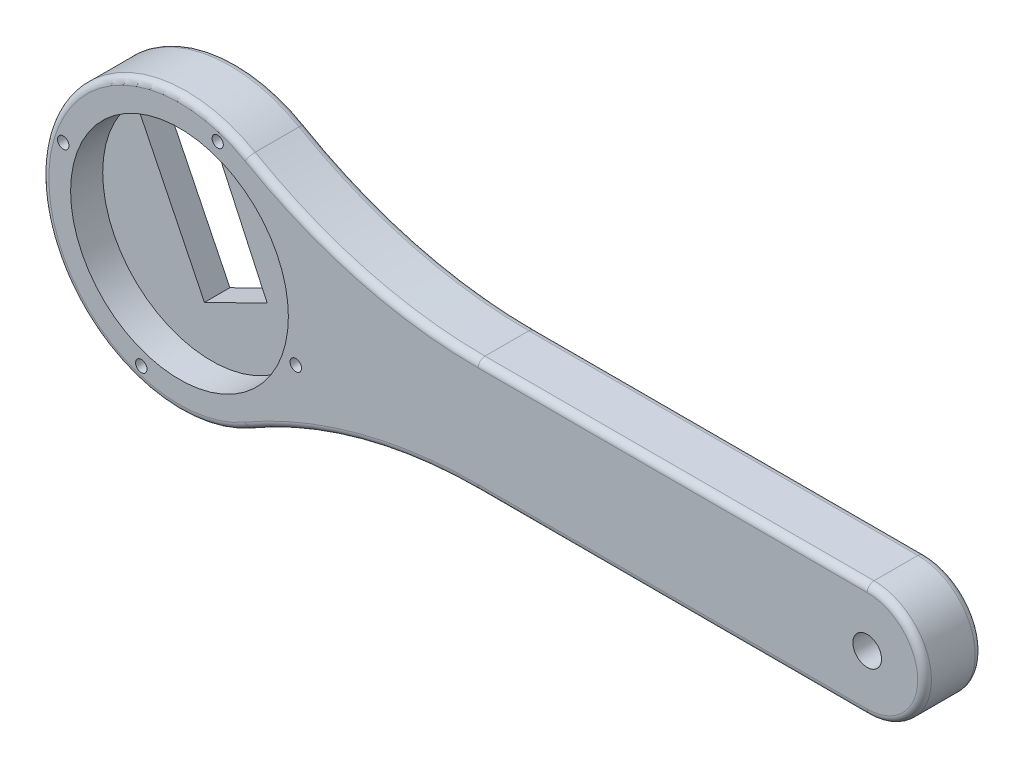
ISO-10303-21;
HEADER;
FILE_DESCRIPTION(('STEP AP214'),'2;1');
FILE_NAME('part.step','',(''),(''),'','','');
FILE_SCHEMA(('AUTOMOTIVE_DESIGN { 1 0 10303 214 1 1 1 1 }'));
ENDSEC;
DATA;
#1=APPLICATION_CONTEXT('core data for automotive mechanical design processes');
#2=APPLICATION_PROTOCOL_DEFINITION('international standard','automotive_design',2000,#1);
#3=PRODUCT_CONTEXT('',#1,'mechanical');
#4=PRODUCT('Part','Part','',(#3));
#5=PRODUCT_RELATED_PRODUCT_CATEGORY('part','',(#4));
#6=PRODUCT_DEFINITION_FORMATION('','',#4);
#7=PRODUCT_DEFINITION_CONTEXT('part definition',#1,'design');
#8=PRODUCT_DEFINITION('design','',#6,#7);
#9=PRODUCT_DEFINITION_SHAPE('','',#8);
#10=(LENGTH_UNIT() NAMED_UNIT(*) SI_UNIT(.MILLI.,.METRE.));
#11=(NAMED_UNIT(*) PLANE_ANGLE_UNIT() SI_UNIT($,.RADIAN.));
#12=(NAMED_UNIT(*) SI_UNIT($,.STERADIAN.) SOLID_ANGLE_UNIT());
#13=UNCERTAINTY_MEASURE_WITH_UNIT(LENGTH_MEASURE(1.E-05),#10,'distance_accuracy_value','');
#14=(GEOMETRIC_REPRESENTATION_CONTEXT(3) GLOBAL_UNCERTAINTY_ASSIGNED_CONTEXT((#13)) GLOBAL_UNIT_ASSIGNED_CONTEXT((#10,
#11,#12)) REPRESENTATION_CONTEXT('',''));
#15=CARTESIAN_POINT('',(0.,0.,0.));
#16=DIRECTION('',(0.,0.,1.));
#17=DIRECTION('',(1.,0.,0.));
#18=AXIS2_PLACEMENT_3D('',#15,#16,#17);
#19=CARTESIAN_POINT('',(0.,0.,25.1));
#20=DIRECTION('',(0.,0.,1.));
#21=DIRECTION('',(1.,0.,0.));
#22=AXIS2_PLACEMENT_3D('',#19,#20,#21);
#23=PLANE('',#22);
#24=DIRECTION('',(1.,0.,0.));
#25=VECTOR('',#24,1.);
#26=CARTESIAN_POINT('',(300.,-22.,25.1));
#27=LINE('',#26,#25);
#28=CARTESIAN_POINT('',(130.288142207954,-22.,25.1));
#29=VERTEX_POINT('',#28);
#30=CARTESIAN_POINT('',(300.,-22.,25.1));
#31=VERTEX_POINT('',#30);
#32=EDGE_CURVE('E52',#29,#31,#27,.T.);
#33=ORIENTED_EDGE('',*,*,#32,.T.);
#34=CARTESIAN_POINT('',(300.,0.,25.1));
#35=DIRECTION('',(0.,0.,1.));
#36=DIRECTION('',(1.,0.,0.));
#37=AXIS2_PLACEMENT_3D('',#34,#35,#36);
#38=CIRCLE('',#37,22.);
#39=CARTESIAN_POINT('',(300.,22.,25.1));
#40=VERTEX_POINT('',#39);
#41=EDGE_CURVE('E317',#31,#40,#38,.T.);
#42=ORIENTED_EDGE('',*,*,#41,.T.);
#43=DIRECTION('',(-1.,0.,0.));
#44=VECTOR('',#43,1.);
#45=CARTESIAN_POINT('',(130.288142207954,22.,25.1));
#46=LINE('',#45,#44);
#47=CARTESIAN_POINT('',(130.288142207954,22.,25.1));
#48=VERTEX_POINT('',#47);
#49=EDGE_CURVE('E309',#40,#48,#46,.T.);
#50=ORIENTED_EDGE('',*,*,#49,.T.);
#51=CARTESIAN_POINT('',(130.288142207954,225.,25.1));
#52=DIRECTION('',(0.,0.,1.));
#53=DIRECTION('',(1.,0.,0.));
#54=AXIS2_PLACEMENT_3D('',#51,#52,#53);
#55=CIRCLE('',#54,203.);
#56=CARTESIAN_POINT('',(28.5631696378976,49.3269230769231,25.1));
#57=VERTEX_POINT('',#56);
#58=EDGE_CURVE('E311',#48,#57,#55,.F.);
#59=ORIENTED_EDGE('',*,*,#58,.T.);
#60=CARTESIAN_POINT('',(0.,0.,25.1));
#61=DIRECTION('',(0.,0.,1.));
#62=DIRECTION('',(1.,0.,0.));
#63=AXIS2_PLACEMENT_3D('',#60,#61,#62);
#64=CIRCLE('',#63,57.);
#65=CARTESIAN_POINT('',(28.5631696378976,-49.3269230769231,25.1));
#66=VERTEX_POINT('',#65);
#67=EDGE_CURVE('E313',#57,#66,#64,.T.);
#68=ORIENTED_EDGE('',*,*,#67,.T.);
#69=CARTESIAN_POINT('',(130.288142207954,-225.,25.1));
#70=DIRECTION('',(0.,0.,1.));
#71=DIRECTION('',(1.,0.,0.));
#72=AXIS2_PLACEMENT_3D('',#69,#70,#71);
#73=CIRCLE('',#72,203.);
#74=EDGE_CURVE('E57',#66,#29,#73,.F.);
#75=ORIENTED_EDGE('',*,*,#74,.T.);
#76=EDGE_LOOP('',(#33,#42,#50,#59,#68,#75));
#77=FACE_BOUND('',#76,.T.);
#78=CARTESIAN_POINT('',(-16.6646971454572,-50.7331044480832,25.1));
#79=DIRECTION('',(0.,0.,1.));
#80=DIRECTION('',(1.,0.,0.));
#81=AXIS2_PLACEMENT_3D('',#78,#79,#80);
#82=CIRCLE('',#81,2.49499865411322);
#83=CARTESIAN_POINT('',(-14.169698491344,-50.7331044480832,25.1));
#84=VERTEX_POINT('',#83);
#85=EDGE_CURVE('E234',#84,#84,#82,.T.);
#86=ORIENTED_EDGE('',*,*,#85,.F.);
#87=EDGE_LOOP('',(#86));
#88=FACE_BOUND('',#87,.T.);
#89=CARTESIAN_POINT('',(-50.7331051137993,16.6646965435116,25.1));
#90=DIRECTION('',(0.,0.,1.));
#91=DIRECTION('',(1.,0.,0.));
#92=AXIS2_PLACEMENT_3D('',#89,#90,#91);
#93=CIRCLE('',#92,2.50000000000001);
#94=CARTESIAN_POINT('',(-48.2331051137992,16.6646965435116,25.1));
#95=VERTEX_POINT('',#94);
#96=EDGE_CURVE('E231',#95,#95,#93,.T.);
#97=ORIENTED_EDGE('',*,*,#96,.F.);
#98=EDGE_LOOP('',(#97));
#99=FACE_BOUND('',#98,.T.);
#100=CARTESIAN_POINT('',(16.6646958777955,50.7331045118536,25.1));
#101=DIRECTION('',(0.,0.,1.));
#102=DIRECTION('',(1.,0.,0.));
#103=AXIS2_PLACEMENT_3D('',#100,#101,#102);
#104=CIRCLE('',#103,2.44444382902341);
#105=CARTESIAN_POINT('',(19.1091397068189,50.7331045118536,25.1));
#106=VERTEX_POINT('',#105);
#107=EDGE_CURVE('E228',#106,#106,#104,.T.);
#108=ORIENTED_EDGE('',*,*,#107,.F.);
#109=EDGE_LOOP('',(#108));
#110=FACE_BOUND('',#109,.T.);
#111=CARTESIAN_POINT('',(50.7331038461375,-16.6646964797411,25.1));
#112=DIRECTION('',(0.,0.,1.));
#113=DIRECTION('',(1.,0.,0.));
#114=AXIS2_PLACEMENT_3D('',#111,#112,#113);
#115=CIRCLE('',#114,2.5);
#116=CARTESIAN_POINT('',(53.2331038461375,-16.6646964797411,25.1));
#117=VERTEX_POINT('',#116);
#118=EDGE_CURVE('E217',#117,#117,#115,.T.);
#119=ORIENTED_EDGE('',*,*,#118,.F.);
#120=EDGE_LOOP('',(#119));
#121=FACE_BOUND('',#120,.T.);
#122=CARTESIAN_POINT('',(0.,0.,25.1));
#123=DIRECTION('',(0.,0.,1.));
#124=DIRECTION('',(1.,0.,0.));
#125=AXIS2_PLACEMENT_3D('',#122,#123,#124);
#126=CIRCLE('',#125,47.5);
#127=CARTESIAN_POINT('',(47.5,0.,25.1));
#128=VERTEX_POINT('',#127);
#129=EDGE_CURVE('E237',#128,#128,#126,.T.);
#130=ORIENTED_EDGE('',*,*,#129,.F.);
#131=EDGE_LOOP('',(#130));
#132=FACE_BOUND('',#131,.T.);
#133=CARTESIAN_POINT('',(300.,0.,25.1));
#134=DIRECTION('',(0.,0.,1.));
#135=DIRECTION('',(1.,0.,0.));
#136=AXIS2_PLACEMENT_3D('',#133,#134,#135);
#137=CIRCLE('',#136,6.25);
#138=CARTESIAN_POINT('',(306.25,0.,25.1));
#139=VERTEX_POINT('',#138);
#140=EDGE_CURVE('E244',#139,#139,#137,.T.);
#141=ORIENTED_EDGE('',*,*,#140,.F.);
#142=EDGE_LOOP('',(#141));
#143=FACE_BOUND('',#142,.T.);
#144=ADVANCED_FACE('F35',(#77,#88,#99,#110,#121,#132,#143),#23,.T.);
#145=CARTESIAN_POINT('',(0.,0.,0.));
#146=DIRECTION('',(0.,0.,1.));
#147=DIRECTION('',(1.,0.,0.));
#148=AXIS2_PLACEMENT_3D('',#145,#146,#147);
#149=PLANE('',#148);
#150=DIRECTION('',(-1.,0.,0.));
#151=VECTOR('',#150,1.);
#152=CARTESIAN_POINT('',(0.,22.,0.));
#153=LINE('',#152,#151);
#154=CARTESIAN_POINT('',(130.288142207954,22.,0.));
#155=VERTEX_POINT('',#154);
#156=CARTESIAN_POINT('',(300.,22.,0.));
#157=VERTEX_POINT('',#156);
#158=EDGE_CURVE('E280',#155,#157,#153,.F.);
#159=ORIENTED_EDGE('',*,*,#158,.T.);
#160=CARTESIAN_POINT('',(300.,0.,0.));
#161=DIRECTION('',(0.,0.,1.));
#162=DIRECTION('',(1.,0.,0.));
#163=AXIS2_PLACEMENT_3D('',#160,#161,#162);
#164=CIRCLE('',#163,22.);
#165=CARTESIAN_POINT('',(300.,-22.,0.));
#166=VERTEX_POINT('',#165);
#167=EDGE_CURVE('E290',#157,#166,#164,.F.);
#168=ORIENTED_EDGE('',*,*,#167,.T.);
#169=DIRECTION('',(1.,0.,0.));
#170=VECTOR('',#169,1.);
#171=CARTESIAN_POINT('',(0.,-22.,0.));
#172=LINE('',#171,#170);
#173=CARTESIAN_POINT('',(130.288142207954,-22.,0.));
#174=VERTEX_POINT('',#173);
#175=EDGE_CURVE('E288',#166,#174,#172,.F.);
#176=ORIENTED_EDGE('',*,*,#175,.T.);
#177=CARTESIAN_POINT('',(130.288142207954,-225.,0.));
#178=DIRECTION('',(0.,0.,1.));
#179=DIRECTION('',(1.,0.,0.));
#180=AXIS2_PLACEMENT_3D('',#177,#178,#179);
#181=CIRCLE('',#180,203.);
#182=CARTESIAN_POINT('',(28.5631696378976,-49.3269230769231,0.));
#183=VERTEX_POINT('',#182);
#184=EDGE_CURVE('E286',#174,#183,#181,.T.);
#185=ORIENTED_EDGE('',*,*,#184,.T.);
#186=CARTESIAN_POINT('',(0.,0.,0.));
#187=DIRECTION('',(0.,0.,1.));
#188=DIRECTION('',(1.,0.,0.));
#189=AXIS2_PLACEMENT_3D('',#186,#187,#188);
#190=CIRCLE('',#189,57.);
#191=CARTESIAN_POINT('',(28.5631696378975,49.326923076923,0.));
#192=VERTEX_POINT('',#191);
#193=EDGE_CURVE('E284',#183,#192,#190,.F.);
#194=ORIENTED_EDGE('',*,*,#193,.T.);
#195=CARTESIAN_POINT('',(130.288142207954,225.,0.));
#196=DIRECTION('',(0.,0.,1.));
#197=DIRECTION('',(1.,0.,0.));
#198=AXIS2_PLACEMENT_3D('',#195,#196,#197);
#199=CIRCLE('',#198,203.);
#200=EDGE_CURVE('E282',#192,#155,#199,.T.);
#201=ORIENTED_EDGE('',*,*,#200,.T.);
#202=EDGE_LOOP('',(#159,#168,#176,#185,#194,#201));
#203=FACE_BOUND('',#202,.T.);
#204=DIRECTION('',(-0.419041540891961,0.907967062732394,0.));
#205=VECTOR('',#204,1.);
#206=CARTESIAN_POINT('',(24.2542425387327,-13.5054924410071,0.));
#207=LINE('',#206,#205);
#208=CARTESIAN_POINT('',(24.2542425387327,-13.5054924410071,0.));
#209=VERTEX_POINT('',#208);
#210=CARTESIAN_POINT('',(-3.65077876777675,46.9582987555049,0.));
#211=VERTEX_POINT('',#210);
#212=EDGE_CURVE('E161',#209,#211,#207,.T.);
#213=ORIENTED_EDGE('',*,*,#212,.T.);
#214=DIRECTION('',(-0.898004276946711,-0.439986725465001,0.));
#215=VECTOR('',#214,1.);
#216=CARTESIAN_POINT('',(-3.65077876777675,46.9582987555049,0.));
#217=LINE('',#216,#215);
#218=CARTESIAN_POINT('',(-32.4009428030412,32.8718507783665,0.));
#219=VERTEX_POINT('',#218);
#220=EDGE_CURVE('E154',#211,#219,#217,.T.);
#221=ORIENTED_EDGE('',*,*,#220,.T.);
#222=DIRECTION('',(0.439986725465001,-0.898004276946711,0.));
#223=VECTOR('',#222,1.);
#224=CARTESIAN_POINT('',(-32.4009428030412,32.8718507783665,0.));
#225=LINE('',#224,#223);
#226=CARTESIAN_POINT('',(-3.10901045049288,-26.9124086326927,0.));
#227=VERTEX_POINT('',#226);
#228=EDGE_CURVE('E165',#219,#227,#225,.T.);
#229=ORIENTED_EDGE('',*,*,#228,.T.);
#230=DIRECTION('',(0.898004276946711,0.439986725465001,0.));
#231=VECTOR('',#230,1.);
#232=CARTESIAN_POINT('',(-3.10901045049288,-26.9124086326927,0.));
#233=LINE('',#232,#231);
#234=EDGE_CURVE('E170',#227,#209,#233,.T.);
#235=ORIENTED_EDGE('',*,*,#234,.T.);
#236=EDGE_LOOP('',(#213,#221,#229,#235));
#237=FACE_BOUND('',#236,.T.);
#238=CARTESIAN_POINT('',(-11.9735029881181,47.2126105483995,0.));
#239=DIRECTION('',(0.,0.,-1.));
#240=DIRECTION('',(-1.,0.,0.));
#241=AXIS2_PLACEMENT_3D('',#238,#239,#240);
#242=CIRCLE('',#241,3.);
#243=CARTESIAN_POINT('',(-14.9735029881181,47.2126105483995,0.));
#244=VERTEX_POINT('',#243);
#245=EDGE_CURVE('E194',#244,#244,#242,.T.);
#246=ORIENTED_EDGE('',*,*,#245,.F.);
#247=EDGE_LOOP('',(#246));
#248=FACE_BOUND('',#247,.T.);
#249=CARTESIAN_POINT('',(-27.3812859892251,40.0292810285461,0.));
#250=DIRECTION('',(0.,0.,-1.));
#251=DIRECTION('',(-1.,0.,0.));
#252=AXIS2_PLACEMENT_3D('',#249,#250,#251);
#253=CIRCLE('',#252,3.);
#254=CARTESIAN_POINT('',(-30.3812859892251,40.0292810285461,0.));
#255=VERTEX_POINT('',#254);
#256=EDGE_CURVE('E200',#255,#255,#253,.T.);
#257=ORIENTED_EDGE('',*,*,#256,.F.);
#258=EDGE_LOOP('',(#257));
#259=FACE_BOUND('',#258,.T.);
#260=CARTESIAN_POINT('',(19.7176566582941,-20.7629026917785,0.));
#261=DIRECTION('',(0.,0.,-1.));
#262=DIRECTION('',(-1.,0.,0.));
#263=AXIS2_PLACEMENT_3D('',#260,#261,#262);
#264=CIRCLE('',#263,3.);
#265=CARTESIAN_POINT('',(16.7176566582941,-20.7629026917785,0.));
#266=VERTEX_POINT('',#265);
#267=EDGE_CURVE('E206',#266,#266,#264,.T.);
#268=ORIENTED_EDGE('',*,*,#267,.F.);
#269=EDGE_LOOP('',(#268));
#270=FACE_BOUND('',#269,.T.);
#271=CARTESIAN_POINT('',(4.30987365718704,-27.9462322116319,0.));
#272=DIRECTION('',(0.,0.,-1.));
#273=DIRECTION('',(-1.,0.,0.));
#274=AXIS2_PLACEMENT_3D('',#271,#272,#273);
#275=CIRCLE('',#274,3.);
#276=CARTESIAN_POINT('',(1.30987365718704,-27.9462322116319,0.));
#277=VERTEX_POINT('',#276);
#278=EDGE_CURVE('E185',#277,#277,#275,.T.);
#279=ORIENTED_EDGE('',*,*,#278,.F.);
#280=EDGE_LOOP('',(#279));
#281=FACE_BOUND('',#280,.T.);
#282=CARTESIAN_POINT('',(-16.6646971454572,-50.7331044480832,0.));
#283=DIRECTION('',(0.,0.,1.));
#284=DIRECTION('',(1.,0.,0.));
#285=AXIS2_PLACEMENT_3D('',#282,#283,#284);
#286=CIRCLE('',#285,2.49499865411322);
#287=CARTESIAN_POINT('',(-14.169698491344,-50.7331044480832,0.));
#288=VERTEX_POINT('',#287);
#289=EDGE_CURVE('E214',#288,#288,#286,.T.);
#290=ORIENTED_EDGE('',*,*,#289,.T.);
#291=EDGE_LOOP('',(#290));
#292=FACE_BOUND('',#291,.T.);
#293=CARTESIAN_POINT('',(-50.7331051137993,16.6646965435116,0.));
#294=DIRECTION('',(0.,0.,1.));
#295=DIRECTION('',(1.,0.,0.));
#296=AXIS2_PLACEMENT_3D('',#293,#294,#295);
#297=CIRCLE('',#296,2.50000000000001);
#298=CARTESIAN_POINT('',(-48.2331051137992,16.6646965435116,0.));
#299=VERTEX_POINT('',#298);
#300=EDGE_CURVE('E218',#299,#299,#297,.T.);
#301=ORIENTED_EDGE('',*,*,#300,.T.);
#302=EDGE_LOOP('',(#301));
#303=FACE_BOUND('',#302,.T.);
#304=CARTESIAN_POINT('',(16.6646958777955,50.7331045118536,0.));
#305=DIRECTION('',(0.,0.,1.));
#306=DIRECTION('',(1.,0.,0.));
#307=AXIS2_PLACEMENT_3D('',#304,#305,#306);
#308=CIRCLE('',#307,2.44444382902341);
#309=CARTESIAN_POINT('',(19.1091397068189,50.7331045118536,0.));
#310=VERTEX_POINT('',#309);
#311=EDGE_CURVE('E221',#310,#310,#308,.T.);
#312=ORIENTED_EDGE('',*,*,#311,.T.);
#313=EDGE_LOOP('',(#312));
#314=FACE_BOUND('',#313,.T.);
#315=CARTESIAN_POINT('',(50.7331038461375,-16.6646964797411,0.));
#316=DIRECTION('',(0.,0.,1.));
#317=DIRECTION('',(1.,0.,0.));
#318=AXIS2_PLACEMENT_3D('',#315,#316,#317);
#319=CIRCLE('',#318,2.5);
#320=CARTESIAN_POINT('',(53.2331038461375,-16.6646964797411,0.));
#321=VERTEX_POINT('',#320);
#322=EDGE_CURVE('E193',#321,#321,#319,.T.);
#323=ORIENTED_EDGE('',*,*,#322,.T.);
#324=EDGE_LOOP('',(#323));
#325=FACE_BOUND('',#324,.T.);
#326=CARTESIAN_POINT('',(300.,0.,0.));
#327=DIRECTION('',(0.,0.,1.));
#328=DIRECTION('',(1.,0.,0.));
#329=AXIS2_PLACEMENT_3D('',#326,#327,#328);
#330=CIRCLE('',#329,6.25);
#331=CARTESIAN_POINT('',(306.25,0.,0.));
#332=VERTEX_POINT('',#331);
#333=EDGE_CURVE('E241',#332,#332,#330,.T.);
#334=ORIENTED_EDGE('',*,*,#333,.T.);
#335=EDGE_LOOP('',(#334));
#336=FACE_BOUND('',#335,.T.);
#337=ADVANCED_FACE('F172',(#203,#237,#248,#259,#270,#281,#292,#303,#314,#325,#336),#149,.F.);
#338=CARTESIAN_POINT('',(0.,0.,25.1));
#339=DIRECTION('',(0.,0.,-1.));
#340=DIRECTION('',(-1.,0.,0.));
#341=AXIS2_PLACEMENT_3D('',#338,#339,#340);
#342=CYLINDRICAL_SURFACE('',#341,60.);
#343=DIRECTION('',(0.,0.,-1.));
#344=VECTOR('',#343,1.);
#345=CARTESIAN_POINT('',(30.0664943556816,51.9230769230769,25.1));
#346=LINE('',#345,#344);
#347=CARTESIAN_POINT('',(30.0664943556816,51.9230769230769,22.1));
#348=VERTEX_POINT('',#347);
#349=CARTESIAN_POINT('',(30.0664943556816,51.9230769230769,3.));
#350=VERTEX_POINT('',#349);
#351=EDGE_CURVE('E265',#348,#350,#346,.T.);
#352=ORIENTED_EDGE('',*,*,#351,.T.);
#353=CARTESIAN_POINT('',(0.,0.,3.));
#354=DIRECTION('',(0.,0.,1.));
#355=DIRECTION('',(1.,0.,0.));
#356=AXIS2_PLACEMENT_3D('',#353,#354,#355);
#357=CIRCLE('',#356,60.);
#358=CARTESIAN_POINT('',(30.0664943556816,-51.9230769230769,3.));
#359=VERTEX_POINT('',#358);
#360=EDGE_CURVE('E303',#350,#359,#357,.T.);
#361=ORIENTED_EDGE('',*,*,#360,.T.);
#362=DIRECTION('',(0.,0.,-1.));
#363=VECTOR('',#362,1.);
#364=CARTESIAN_POINT('',(30.0664943556816,-51.9230769230769,25.1));
#365=LINE('',#364,#363);
#366=CARTESIAN_POINT('',(30.0664943556816,-51.9230769230769,22.1));
#367=VERTEX_POINT('',#366);
#368=EDGE_CURVE('E268',#359,#367,#365,.F.);
#369=ORIENTED_EDGE('',*,*,#368,.T.);
#370=CARTESIAN_POINT('',(0.,0.,22.1));
#371=DIRECTION('',(0.,0.,1.));
#372=DIRECTION('',(1.,0.,0.));
#373=AXIS2_PLACEMENT_3D('',#370,#371,#372);
#374=CIRCLE('',#373,60.);
#375=EDGE_CURVE('E301',#367,#348,#374,.F.);
#376=ORIENTED_EDGE('',*,*,#375,.T.);
#377=EDGE_LOOP('',(#352,#361,#369,#376));
#378=FACE_BOUND('',#377,.T.);
#379=ADVANCED_FACE('F357',(#378),#342,.T.);
#380=CARTESIAN_POINT('',(54.5435605731786,-25.,25.1));
#381=DIRECTION('',(0.,1.,0.));
#382=DIRECTION('',(0.,0.,1.));
#383=AXIS2_PLACEMENT_3D('',#380,#381,#382);
#384=PLANE('',#383);
#385=DIRECTION('',(0.,0.,1.));
#386=VECTOR('',#385,1.);
#387=CARTESIAN_POINT('',(130.288142207954,-25.,0.));
#388=LINE('',#387,#386);
#389=CARTESIAN_POINT('',(130.288142207954,-25.,22.1));
#390=VERTEX_POINT('',#389);
#391=CARTESIAN_POINT('',(130.288142207954,-25.,3.));
#392=VERTEX_POINT('',#391);
#393=EDGE_CURVE('E262',#390,#392,#388,.F.);
#394=ORIENTED_EDGE('',*,*,#393,.T.);
#395=DIRECTION('',(1.,0.,0.));
#396=VECTOR('',#395,1.);
#397=CARTESIAN_POINT('',(54.5435605731786,-25.,3.));
#398=LINE('',#397,#396);
#399=CARTESIAN_POINT('',(300.,-25.,3.));
#400=VERTEX_POINT('',#399);
#401=EDGE_CURVE('E295',#392,#400,#398,.T.);
#402=ORIENTED_EDGE('',*,*,#401,.T.);
#403=DIRECTION('',(0.,0.,-1.));
#404=VECTOR('',#403,1.);
#405=CARTESIAN_POINT('',(300.,-25.,25.1));
#406=LINE('',#405,#404);
#407=CARTESIAN_POINT('',(300.,-25.,22.1));
#408=VERTEX_POINT('',#407);
#409=EDGE_CURVE('E252',#408,#400,#406,.T.);
#410=ORIENTED_EDGE('',*,*,#409,.F.);
#411=DIRECTION('',(1.,0.,0.));
#412=VECTOR('',#411,1.);
#413=CARTESIAN_POINT('',(130.288142207954,-25.,22.1));
#414=LINE('',#413,#412);
#415=EDGE_CURVE('E293',#408,#390,#414,.F.);
#416=ORIENTED_EDGE('',*,*,#415,.T.);
#417=EDGE_LOOP('',(#394,#402,#410,#416));
#418=FACE_BOUND('',#417,.T.);
#419=ADVANCED_FACE('F397',(#418),#384,.F.);
#420=CARTESIAN_POINT('',(300.,0.,25.1));
#421=DIRECTION('',(0.,0.,-1.));
#422=DIRECTION('',(-1.,0.,0.));
#423=AXIS2_PLACEMENT_3D('',#420,#421,#422);
#424=CYLINDRICAL_SURFACE('',#423,25.);
#425=ORIENTED_EDGE('',*,*,#409,.T.);
#426=CARTESIAN_POINT('',(300.,0.,3.));
#427=DIRECTION('',(0.,0.,1.));
#428=DIRECTION('',(1.,0.,0.));
#429=AXIS2_PLACEMENT_3D('',#426,#427,#428);
#430=CIRCLE('',#429,25.);
#431=CARTESIAN_POINT('',(300.,25.,3.));
#432=VERTEX_POINT('',#431);
#433=EDGE_CURVE('E277',#400,#432,#430,.T.);
#434=ORIENTED_EDGE('',*,*,#433,.T.);
#435=DIRECTION('',(0.,0.,-1.));
#436=VECTOR('',#435,1.);
#437=CARTESIAN_POINT('',(300.,25.,25.1));
#438=LINE('',#437,#436);
#439=CARTESIAN_POINT('',(300.,25.,22.1));
#440=VERTEX_POINT('',#439);
#441=EDGE_CURVE('E247',#440,#432,#438,.T.);
#442=ORIENTED_EDGE('',*,*,#441,.F.);
#443=CARTESIAN_POINT('',(300.,0.,22.1));
#444=DIRECTION('',(0.,0.,1.));
#445=DIRECTION('',(1.,0.,0.));
#446=AXIS2_PLACEMENT_3D('',#443,#444,#445);
#447=CIRCLE('',#446,25.);
#448=EDGE_CURVE('E274',#440,#408,#447,.F.);
#449=ORIENTED_EDGE('',*,*,#448,.T.);
#450=EDGE_LOOP('',(#425,#434,#442,#449));
#451=FACE_BOUND('',#450,.T.);
#452=ADVANCED_FACE('F406',(#451),#424,.T.);
#453=CARTESIAN_POINT('',(54.5435605731786,25.,25.1));
#454=DIRECTION('',(0.,-1.,0.));
#455=DIRECTION('',(0.,0.,-1.));
#456=AXIS2_PLACEMENT_3D('',#453,#454,#455);
#457=PLANE('',#456);
#458=ORIENTED_EDGE('',*,*,#441,.T.);
#459=DIRECTION('',(-1.,0.,0.));
#460=VECTOR('',#459,1.);
#461=CARTESIAN_POINT('',(54.5435605731786,25.,3.));
#462=LINE('',#461,#460);
#463=CARTESIAN_POINT('',(130.288142207954,25.,3.));
#464=VERTEX_POINT('',#463);
#465=EDGE_CURVE('E11',#432,#464,#462,.T.);
#466=ORIENTED_EDGE('',*,*,#465,.T.);
#467=DIRECTION('',(0.,0.,1.));
#468=VECTOR('',#467,1.);
#469=CARTESIAN_POINT('',(130.288142207954,25.,25.1));
#470=LINE('',#469,#468);
#471=CARTESIAN_POINT('',(130.288142207954,25.,22.1));
#472=VERTEX_POINT('',#471);
#473=EDGE_CURVE('E271',#464,#472,#470,.T.);
#474=ORIENTED_EDGE('',*,*,#473,.T.);
#475=DIRECTION('',(-1.,0.,0.));
#476=VECTOR('',#475,1.);
#477=CARTESIAN_POINT('',(300.,25.,22.1));
#478=LINE('',#477,#476);
#479=EDGE_CURVE('E44',#472,#440,#478,.F.);
#480=ORIENTED_EDGE('',*,*,#479,.T.);
#481=EDGE_LOOP('',(#458,#466,#474,#480));
#482=FACE_BOUND('',#481,.T.);
#483=ADVANCED_FACE('F434',(#482),#457,.F.);
#484=CARTESIAN_POINT('',(300.,0.,25.1));
#485=DIRECTION('',(0.,0.,-1.));
#486=DIRECTION('',(-1.,0.,0.));
#487=AXIS2_PLACEMENT_3D('',#484,#485,#486);
#488=CYLINDRICAL_SURFACE('',#487,6.25);
#489=ORIENTED_EDGE('',*,*,#140,.T.);
#490=EDGE_LOOP('',(#489));
#491=FACE_BOUND('',#490,.T.);
#492=ORIENTED_EDGE('',*,*,#333,.F.);
#493=EDGE_LOOP('',(#492));
#494=FACE_BOUND('',#493,.T.);
#495=ADVANCED_FACE('F430',(#491,#494),#488,.F.);
#496=CARTESIAN_POINT('',(0.,0.,11.1));
#497=DIRECTION('',(0.,0.,1.));
#498=DIRECTION('',(1.,0.,0.));
#499=AXIS2_PLACEMENT_3D('',#496,#497,#498);
#500=CYLINDRICAL_SURFACE('',#499,47.5);
#501=CARTESIAN_POINT('',(0.,0.,11.1));
#502=DIRECTION('',(0.,0.,1.));
#503=DIRECTION('',(1.,0.,0.));
#504=AXIS2_PLACEMENT_3D('',#501,#502,#503);
#505=CIRCLE('',#504,47.5);
#506=CARTESIAN_POINT('',(47.5,0.,11.1));
#507=VERTEX_POINT('',#506);
#508=EDGE_CURVE('E238',#507,#507,#505,.T.);
#509=ORIENTED_EDGE('',*,*,#508,.F.);
#510=EDGE_LOOP('',(#509));
#511=FACE_BOUND('',#510,.T.);
#512=ORIENTED_EDGE('',*,*,#129,.T.);
#513=EDGE_LOOP('',(#512));
#514=FACE_BOUND('',#513,.T.);
#515=ADVANCED_FACE('F433',(#511,#514),#500,.F.);
#516=CARTESIAN_POINT('',(0.,0.,11.1));
#517=DIRECTION('',(0.,0.,1.));
#518=DIRECTION('',(1.,0.,0.));
#519=AXIS2_PLACEMENT_3D('',#516,#517,#518);
#520=PLANE('',#519);
#521=DIRECTION('',(-0.898004276946711,-0.439986725465001,0.));
#522=VECTOR('',#521,1.);
#523=CARTESIAN_POINT('',(-19.2604397256494,39.3101797133271,11.1));
#524=LINE('',#523,#522);
#525=CARTESIAN_POINT('',(-3.65077876777675,46.9582987555049,11.1));
#526=VERTEX_POINT('',#525);
#527=CARTESIAN_POINT('',(-32.4009428030412,32.8718507783665,11.1));
#528=VERTEX_POINT('',#527);
#529=EDGE_CURVE('E157',#526,#528,#524,.T.);
#530=ORIENTED_EDGE('',*,*,#529,.F.);
#531=DIRECTION('',(-0.419041540891961,0.907967062732394,0.));
#532=VECTOR('',#531,1.);
#533=CARTESIAN_POINT('',(14.8567844799547,6.85664724714234,11.1));
#534=LINE('',#533,#532);
#535=CARTESIAN_POINT('',(24.2542425387327,-13.5054924410071,11.1));
#536=VERTEX_POINT('',#535);
#537=EDGE_CURVE('E259',#536,#526,#534,.T.);
#538=ORIENTED_EDGE('',*,*,#537,.F.);
#539=DIRECTION('',(0.898004276946711,0.439986725465001,0.));
#540=VECTOR('',#539,1.);
#541=CARTESIAN_POINT('',(10.0314926268989,-20.4740796977321,11.1));
#542=LINE('',#541,#540);
#543=CARTESIAN_POINT('',(-3.10901045049288,-26.9124086326927,11.1));
#544=VERTEX_POINT('',#543);
#545=EDGE_CURVE('E257',#544,#536,#542,.T.);
#546=ORIENTED_EDGE('',*,*,#545,.F.);
#547=DIRECTION('',(0.439986725465001,-0.898004276946711,0.));
#548=VECTOR('',#547,1.);
#549=CARTESIAN_POINT('',(-13.1405030773918,-6.43832893496059,11.1));
#550=LINE('',#549,#548);
#551=EDGE_CURVE('E255',#528,#544,#550,.T.);
#552=ORIENTED_EDGE('',*,*,#551,.F.);
#553=EDGE_LOOP('',(#530,#538,#546,#552));
#554=FACE_BOUND('',#553,.T.);
#555=ORIENTED_EDGE('',*,*,#508,.T.);
#556=EDGE_LOOP('',(#555));
#557=FACE_BOUND('',#556,.T.);
#558=ADVANCED_FACE('F640',(#554,#557),#520,.T.);
#559=CARTESIAN_POINT('',(50.7331038461375,-16.6646964797411,0.));
#560=DIRECTION('',(0.,0.,1.));
#561=DIRECTION('',(1.,0.,0.));
#562=AXIS2_PLACEMENT_3D('',#559,#560,#561);
#563=CYLINDRICAL_SURFACE('',#562,2.5);
#564=ORIENTED_EDGE('',*,*,#118,.T.);
#565=EDGE_LOOP('',(#564));
#566=FACE_BOUND('',#565,.T.);
#567=ORIENTED_EDGE('',*,*,#322,.F.);
#568=EDGE_LOOP('',(#567));
#569=FACE_BOUND('',#568,.T.);
#570=ADVANCED_FACE('F632',(#566,#569),#563,.F.);
#571=CARTESIAN_POINT('',(16.6646958777955,50.7331045118536,0.));
#572=DIRECTION('',(0.,0.,1.));
#573=DIRECTION('',(1.,0.,0.));
#574=AXIS2_PLACEMENT_3D('',#571,#572,#573);
#575=CYLINDRICAL_SURFACE('',#574,2.44444382902341);
#576=ORIENTED_EDGE('',*,*,#107,.T.);
#577=EDGE_LOOP('',(#576));
#578=FACE_BOUND('',#577,.T.);
#579=ORIENTED_EDGE('',*,*,#311,.F.);
#580=EDGE_LOOP('',(#579));
#581=FACE_BOUND('',#580,.T.);
#582=ADVANCED_FACE('F624',(#578,#581),#575,.F.);
#583=CARTESIAN_POINT('',(-50.7331051137993,16.6646965435116,0.));
#584=DIRECTION('',(0.,0.,1.));
#585=DIRECTION('',(1.,0.,0.));
#586=AXIS2_PLACEMENT_3D('',#583,#584,#585);
#587=CYLINDRICAL_SURFACE('',#586,2.50000000000001);
#588=ORIENTED_EDGE('',*,*,#96,.T.);
#589=EDGE_LOOP('',(#588));
#590=FACE_BOUND('',#589,.T.);
#591=ORIENTED_EDGE('',*,*,#300,.F.);
#592=EDGE_LOOP('',(#591));
#593=FACE_BOUND('',#592,.T.);
#594=ADVANCED_FACE('F616',(#590,#593),#587,.F.);
#595=CARTESIAN_POINT('',(-16.6646971454572,-50.7331044480832,0.));
#596=DIRECTION('',(0.,0.,1.));
#597=DIRECTION('',(1.,0.,0.));
#598=AXIS2_PLACEMENT_3D('',#595,#596,#597);
#599=CYLINDRICAL_SURFACE('',#598,2.49499865411322);
#600=ORIENTED_EDGE('',*,*,#85,.T.);
#601=EDGE_LOOP('',(#600));
#602=FACE_BOUND('',#601,.T.);
#603=ORIENTED_EDGE('',*,*,#289,.F.);
#604=EDGE_LOOP('',(#603));
#605=FACE_BOUND('',#604,.T.);
#606=ADVANCED_FACE('F608',(#602,#605),#599,.F.);
#607=CARTESIAN_POINT('',(4.30987365718704,-27.9462322116319,6.));
#608=DIRECTION('',(0.,0.,-1.));
#609=DIRECTION('',(-1.,0.,0.));
#610=AXIS2_PLACEMENT_3D('',#607,#608,#609);
#611=CYLINDRICAL_SURFACE('',#610,3.);
#612=CARTESIAN_POINT('',(4.30987365718704,-27.9462322116319,6.));
#613=DIRECTION('',(0.,0.,-1.));
#614=DIRECTION('',(-1.,0.,0.));
#615=AXIS2_PLACEMENT_3D('',#612,#613,#614);
#616=CIRCLE('',#615,3.);
#617=CARTESIAN_POINT('',(1.30987365718704,-27.9462322116319,6.));
#618=VERTEX_POINT('',#617);
#619=EDGE_CURVE('E209',#618,#618,#616,.T.);
#620=ORIENTED_EDGE('',*,*,#619,.F.);
#621=EDGE_LOOP('',(#620));
#622=FACE_BOUND('',#621,.T.);
#623=ORIENTED_EDGE('',*,*,#278,.T.);
#624=EDGE_LOOP('',(#623));
#625=FACE_BOUND('',#624,.T.);
#626=ADVANCED_FACE('F600',(#622,#625),#611,.F.);
#627=CARTESIAN_POINT('',(4.30987365718704,-27.9462322116319,6.));
#628=DIRECTION('',(0.,0.,-1.));
#629=DIRECTION('',(-1.,0.,0.));
#630=AXIS2_PLACEMENT_3D('',#627,#628,#629);
#631=PLANE('',#630);
#632=ORIENTED_EDGE('',*,*,#619,.T.);
#633=EDGE_LOOP('',(#632));
#634=FACE_BOUND('',#633,.T.);
#635=ADVANCED_FACE('F592',(#634),#631,.T.);
#636=CARTESIAN_POINT('',(19.7176566582941,-20.7629026917785,6.));
#637=DIRECTION('',(0.,0.,-1.));
#638=DIRECTION('',(-1.,0.,0.));
#639=AXIS2_PLACEMENT_3D('',#636,#637,#638);
#640=CYLINDRICAL_SURFACE('',#639,3.);
#641=CARTESIAN_POINT('',(19.7176566582941,-20.7629026917785,6.));
#642=DIRECTION('',(0.,0.,-1.));
#643=DIRECTION('',(-1.,0.,0.));
#644=AXIS2_PLACEMENT_3D('',#641,#642,#643);
#645=CIRCLE('',#644,3.);
#646=CARTESIAN_POINT('',(16.7176566582941,-20.7629026917785,6.));
#647=VERTEX_POINT('',#646);
#648=EDGE_CURVE('E203',#647,#647,#645,.T.);
#649=ORIENTED_EDGE('',*,*,#648,.F.);
#650=EDGE_LOOP('',(#649));
#651=FACE_BOUND('',#650,.T.);
#652=ORIENTED_EDGE('',*,*,#267,.T.);
#653=EDGE_LOOP('',(#652));
#654=FACE_BOUND('',#653,.T.);
#655=ADVANCED_FACE('F584',(#651,#654),#640,.F.);
#656=CARTESIAN_POINT('',(19.7176566582941,-20.7629026917785,6.));
#657=DIRECTION('',(0.,0.,-1.));
#658=DIRECTION('',(-1.,0.,0.));
#659=AXIS2_PLACEMENT_3D('',#656,#657,#658);
#660=PLANE('',#659);
#661=ORIENTED_EDGE('',*,*,#648,.T.);
#662=EDGE_LOOP('',(#661));
#663=FACE_BOUND('',#662,.T.);
#664=ADVANCED_FACE('F576',(#663),#660,.T.);
#665=CARTESIAN_POINT('',(-27.3812859892251,40.0292810285461,6.));
#666=DIRECTION('',(0.,0.,-1.));
#667=DIRECTION('',(-1.,0.,0.));
#668=AXIS2_PLACEMENT_3D('',#665,#666,#667);
#669=CYLINDRICAL_SURFACE('',#668,3.);
#670=CARTESIAN_POINT('',(-27.3812859892251,40.0292810285461,6.));
#671=DIRECTION('',(0.,0.,-1.));
#672=DIRECTION('',(-1.,0.,0.));
#673=AXIS2_PLACEMENT_3D('',#670,#671,#672);
#674=CIRCLE('',#673,3.);
#675=CARTESIAN_POINT('',(-30.3812859892251,40.0292810285461,6.));
#676=VERTEX_POINT('',#675);
#677=EDGE_CURVE('E197',#676,#676,#674,.T.);
#678=ORIENTED_EDGE('',*,*,#677,.F.);
#679=EDGE_LOOP('',(#678));
#680=FACE_BOUND('',#679,.T.);
#681=ORIENTED_EDGE('',*,*,#256,.T.);
#682=EDGE_LOOP('',(#681));
#683=FACE_BOUND('',#682,.T.);
#684=ADVANCED_FACE('F568',(#680,#683),#669,.F.);
#685=CARTESIAN_POINT('',(-27.3812859892251,40.0292810285461,6.));
#686=DIRECTION('',(0.,0.,-1.));
#687=DIRECTION('',(-1.,0.,0.));
#688=AXIS2_PLACEMENT_3D('',#685,#686,#687);
#689=PLANE('',#688);
#690=ORIENTED_EDGE('',*,*,#677,.T.);
#691=EDGE_LOOP('',(#690));
#692=FACE_BOUND('',#691,.T.);
#693=ADVANCED_FACE('F560',(#692),#689,.T.);
#694=CARTESIAN_POINT('',(-11.9735029881181,47.2126105483995,6.));
#695=DIRECTION('',(0.,0.,-1.));
#696=DIRECTION('',(-1.,0.,0.));
#697=AXIS2_PLACEMENT_3D('',#694,#695,#696);
#698=CYLINDRICAL_SURFACE('',#697,3.);
#699=CARTESIAN_POINT('',(-11.9735029881181,47.2126105483995,6.));
#700=DIRECTION('',(0.,0.,-1.));
#701=DIRECTION('',(-1.,0.,0.));
#702=AXIS2_PLACEMENT_3D('',#699,#700,#701);
#703=CIRCLE('',#702,3.);
#704=CARTESIAN_POINT('',(-14.9735029881181,47.2126105483995,6.));
#705=VERTEX_POINT('',#704);
#706=EDGE_CURVE('E190',#705,#705,#703,.T.);
#707=ORIENTED_EDGE('',*,*,#706,.F.);
#708=EDGE_LOOP('',(#707));
#709=FACE_BOUND('',#708,.T.);
#710=ORIENTED_EDGE('',*,*,#245,.T.);
#711=EDGE_LOOP('',(#710));
#712=FACE_BOUND('',#711,.T.);
#713=ADVANCED_FACE('F552',(#709,#712),#698,.F.);
#714=CARTESIAN_POINT('',(-11.9735029881181,47.2126105483995,6.));
#715=DIRECTION('',(0.,0.,-1.));
#716=DIRECTION('',(-1.,0.,0.));
#717=AXIS2_PLACEMENT_3D('',#714,#715,#716);
#718=PLANE('',#717);
#719=ORIENTED_EDGE('',*,*,#706,.T.);
#720=EDGE_LOOP('',(#719));
#721=FACE_BOUND('',#720,.T.);
#722=ADVANCED_FACE('F544',(#721),#718,.T.);
#723=CARTESIAN_POINT('',(-3.65077876777675,46.9582987555049,0.));
#724=DIRECTION('',(-0.439986725465001,0.898004276946711,0.));
#725=DIRECTION('',(-0.898004276946711,-0.439986725465001,0.));
#726=AXIS2_PLACEMENT_3D('',#723,#724,#725);
#727=PLANE('',#726);
#728=ORIENTED_EDGE('',*,*,#529,.T.);
#729=DIRECTION('',(0.,0.,1.));
#730=VECTOR('',#729,1.);
#731=CARTESIAN_POINT('',(-32.4009428030412,32.8718507783665,0.));
#732=LINE('',#731,#730);
#733=EDGE_CURVE('E149',#219,#528,#732,.T.);
#734=ORIENTED_EDGE('',*,*,#733,.F.);
#735=ORIENTED_EDGE('',*,*,#220,.F.);
#736=DIRECTION('',(0.,0.,1.));
#737=VECTOR('',#736,1.);
#738=CARTESIAN_POINT('',(-3.65077876777675,46.9582987555049,0.));
#739=LINE('',#738,#737);
#740=EDGE_CURVE('E183',#211,#526,#739,.T.);
#741=ORIENTED_EDGE('',*,*,#740,.T.);
#742=EDGE_LOOP('',(#728,#734,#735,#741));
#743=FACE_BOUND('',#742,.T.);
#744=ADVANCED_FACE('F151',(#743),#727,.F.);
#745=CARTESIAN_POINT('',(24.2542425387327,-13.5054924410071,0.));
#746=DIRECTION('',(0.907967062732394,0.419041540891961,0.));
#747=DIRECTION('',(-0.419041540891961,0.907967062732394,0.));
#748=AXIS2_PLACEMENT_3D('',#745,#746,#747);
#749=PLANE('',#748);
#750=ORIENTED_EDGE('',*,*,#537,.T.);
#751=ORIENTED_EDGE('',*,*,#740,.F.);
#752=ORIENTED_EDGE('',*,*,#212,.F.);
#753=DIRECTION('',(0.,0.,1.));
#754=VECTOR('',#753,1.);
#755=CARTESIAN_POINT('',(24.2542425387327,-13.5054924410071,0.));
#756=LINE('',#755,#754);
#757=EDGE_CURVE('E186',#209,#536,#756,.T.);
#758=ORIENTED_EDGE('',*,*,#757,.T.);
#759=EDGE_LOOP('',(#750,#751,#752,#758));
#760=FACE_BOUND('',#759,.T.);
#761=ADVANCED_FACE('F529',(#760),#749,.F.);
#762=CARTESIAN_POINT('',(-3.10901045049288,-26.9124086326927,0.));
#763=DIRECTION('',(0.439986725465001,-0.898004276946711,0.));
#764=DIRECTION('',(0.898004276946711,0.439986725465001,0.));
#765=AXIS2_PLACEMENT_3D('',#762,#763,#764);
#766=PLANE('',#765);
#767=ORIENTED_EDGE('',*,*,#545,.T.);
#768=ORIENTED_EDGE('',*,*,#757,.F.);
#769=ORIENTED_EDGE('',*,*,#234,.F.);
#770=DIRECTION('',(0.,0.,1.));
#771=VECTOR('',#770,1.);
#772=CARTESIAN_POINT('',(-3.10901045049288,-26.9124086326927,0.));
#773=LINE('',#772,#771);
#774=EDGE_CURVE('E160',#227,#544,#773,.T.);
#775=ORIENTED_EDGE('',*,*,#774,.T.);
#776=EDGE_LOOP('',(#767,#768,#769,#775));
#777=FACE_BOUND('',#776,.T.);
#778=ADVANCED_FACE('F521',(#777),#766,.F.);
#779=CARTESIAN_POINT('',(-32.4009428030412,32.8718507783665,0.));
#780=DIRECTION('',(-0.898004276946711,-0.439986725465001,0.));
#781=DIRECTION('',(0.439986725465001,-0.898004276946711,0.));
#782=AXIS2_PLACEMENT_3D('',#779,#780,#781);
#783=PLANE('',#782);
#784=ORIENTED_EDGE('',*,*,#551,.T.);
#785=ORIENTED_EDGE('',*,*,#774,.F.);
#786=ORIENTED_EDGE('',*,*,#228,.F.);
#787=ORIENTED_EDGE('',*,*,#733,.T.);
#788=EDGE_LOOP('',(#784,#785,#786,#787));
#789=FACE_BOUND('',#788,.T.);
#790=ADVANCED_FACE('F166',(#789),#783,.F.);
#791=CARTESIAN_POINT('',(130.288142207954,-225.,25.1));
#792=DIRECTION('',(0.,0.,-1.));
#793=DIRECTION('',(-1.,0.,0.));
#794=AXIS2_PLACEMENT_3D('',#791,#792,#793);
#795=CYLINDRICAL_SURFACE('',#794,200.);
#796=ORIENTED_EDGE('',*,*,#368,.F.);
#797=CARTESIAN_POINT('',(130.288142207954,-225.,3.));
#798=DIRECTION('',(0.,0.,1.));
#799=DIRECTION('',(1.,0.,0.));
#800=AXIS2_PLACEMENT_3D('',#797,#798,#799);
#801=CIRCLE('',#800,200.);
#802=EDGE_CURVE('E299',#359,#392,#801,.F.);
#803=ORIENTED_EDGE('',*,*,#802,.T.);
#804=ORIENTED_EDGE('',*,*,#393,.F.);
#805=CARTESIAN_POINT('',(130.288142207954,-225.,22.1));
#806=DIRECTION('',(0.,0.,1.));
#807=DIRECTION('',(1.,0.,0.));
#808=AXIS2_PLACEMENT_3D('',#805,#806,#807);
#809=CIRCLE('',#808,200.);
#810=EDGE_CURVE('E297',#390,#367,#809,.T.);
#811=ORIENTED_EDGE('',*,*,#810,.T.);
#812=EDGE_LOOP('',(#796,#803,#804,#811));
#813=FACE_BOUND('',#812,.T.);
#814=ADVANCED_FACE('F394',(#813),#795,.F.);
#815=CARTESIAN_POINT('',(130.288142207954,225.,25.1));
#816=DIRECTION('',(0.,0.,-1.));
#817=DIRECTION('',(-1.,0.,0.));
#818=AXIS2_PLACEMENT_3D('',#815,#816,#817);
#819=CYLINDRICAL_SURFACE('',#818,200.);
#820=ORIENTED_EDGE('',*,*,#473,.F.);
#821=CARTESIAN_POINT('',(130.288142207954,225.,3.));
#822=DIRECTION('',(0.,0.,1.));
#823=DIRECTION('',(1.,0.,0.));
#824=AXIS2_PLACEMENT_3D('',#821,#822,#823);
#825=CIRCLE('',#824,200.);
#826=EDGE_CURVE('E307',#464,#350,#825,.F.);
#827=ORIENTED_EDGE('',*,*,#826,.T.);
#828=ORIENTED_EDGE('',*,*,#351,.F.);
#829=CARTESIAN_POINT('',(130.288142207954,225.,22.1));
#830=DIRECTION('',(0.,0.,1.));
#831=DIRECTION('',(1.,0.,0.));
#832=AXIS2_PLACEMENT_3D('',#829,#830,#831);
#833=CIRCLE('',#832,200.);
#834=EDGE_CURVE('E305',#348,#472,#833,.T.);
#835=ORIENTED_EDGE('',*,*,#834,.T.);
#836=EDGE_LOOP('',(#820,#827,#828,#835));
#837=FACE_BOUND('',#836,.T.);
#838=ADVANCED_FACE('F362',(#837),#819,.F.);
#839=CARTESIAN_POINT('',(0.,0.,3.));
#840=DIRECTION('',(0.,0.,1.));
#841=DIRECTION('',(1.,0.,0.));
#842=AXIS2_PLACEMENT_3D('',#839,#840,#841);
#843=TOROIDAL_SURFACE('',#842,57.,3.);
#844=CARTESIAN_POINT('',(28.5631696378976,49.3269230769231,3.));
#845=DIRECTION('',(0.865384615384615,-0.501108239261361,0.));
#846=DIRECTION('',(0.501108239261361,0.865384615384616,0.));
#847=AXIS2_PLACEMENT_3D('',#844,#845,#846);
#848=CIRCLE('',#847,3.);
#849=EDGE_CURVE('E178',#192,#350,#848,.T.);
#850=ORIENTED_EDGE('',*,*,#849,.F.);
#851=ORIENTED_EDGE('',*,*,#193,.F.);
#852=CARTESIAN_POINT('',(28.5631696378976,-49.3269230769231,3.));
#853=DIRECTION('',(0.865384615384615,0.501108239261361,0.));
#854=DIRECTION('',(-0.501108239261361,0.865384615384615,0.));
#855=AXIS2_PLACEMENT_3D('',#852,#853,#854);
#856=CIRCLE('',#855,3.);
#857=EDGE_CURVE('E175',#359,#183,#856,.T.);
#858=ORIENTED_EDGE('',*,*,#857,.F.);
#859=ORIENTED_EDGE('',*,*,#360,.F.);
#860=EDGE_LOOP('',(#850,#851,#858,#859));
#861=FACE_BOUND('',#860,.T.);
#862=ADVANCED_FACE('F392',(#861),#843,.T.);
#863=CARTESIAN_POINT('',(130.288142207954,-225.,3.));
#864=DIRECTION('',(0.,0.,1.));
#865=DIRECTION('',(1.,0.,0.));
#866=AXIS2_PLACEMENT_3D('',#863,#864,#865);
#867=TOROIDAL_SURFACE('',#866,203.,3.);
#868=ORIENTED_EDGE('',*,*,#857,.T.);
#869=ORIENTED_EDGE('',*,*,#184,.F.);
#870=CARTESIAN_POINT('',(130.288142207954,-22.,3.));
#871=DIRECTION('',(1.,0.,0.));
#872=DIRECTION('',(0.,0.,-1.));
#873=AXIS2_PLACEMENT_3D('',#870,#871,#872);
#874=CIRCLE('',#873,3.);
#875=EDGE_CURVE('E327',#392,#174,#874,.T.);
#876=ORIENTED_EDGE('',*,*,#875,.F.);
#877=ORIENTED_EDGE('',*,*,#802,.F.);
#878=EDGE_LOOP('',(#868,#869,#876,#877));
#879=FACE_BOUND('',#878,.T.);
#880=ADVANCED_FACE('F388',(#879),#867,.T.);
#881=CARTESIAN_POINT('',(130.288142207954,225.,3.));
#882=DIRECTION('',(0.,0.,1.));
#883=DIRECTION('',(1.,0.,0.));
#884=AXIS2_PLACEMENT_3D('',#881,#882,#883);
#885=TOROIDAL_SURFACE('',#884,203.,3.);
#886=ORIENTED_EDGE('',*,*,#849,.T.);
#887=ORIENTED_EDGE('',*,*,#826,.F.);
#888=CARTESIAN_POINT('',(130.288142207954,22.,3.));
#889=DIRECTION('',(1.,0.,0.));
#890=DIRECTION('',(0.,0.,-1.));
#891=AXIS2_PLACEMENT_3D('',#888,#889,#890);
#892=CIRCLE('',#891,3.);
#893=EDGE_CURVE('E324',#155,#464,#892,.T.);
#894=ORIENTED_EDGE('',*,*,#893,.F.);
#895=ORIENTED_EDGE('',*,*,#200,.F.);
#896=EDGE_LOOP('',(#886,#887,#894,#895));
#897=FACE_BOUND('',#896,.T.);
#898=ADVANCED_FACE('F366',(#897),#885,.T.);
#899=CARTESIAN_POINT('',(54.5435605731786,-22.,3.));
#900=DIRECTION('',(1.,0.,0.));
#901=DIRECTION('',(0.,0.,-1.));
#902=AXIS2_PLACEMENT_3D('',#899,#900,#901);
#903=CYLINDRICAL_SURFACE('',#902,3.);
#904=ORIENTED_EDGE('',*,*,#875,.T.);
#905=ORIENTED_EDGE('',*,*,#175,.F.);
#906=CARTESIAN_POINT('',(300.,-22.,3.));
#907=DIRECTION('',(1.,0.,0.));
#908=DIRECTION('',(0.,0.,-1.));
#909=AXIS2_PLACEMENT_3D('',#906,#907,#908);
#910=CIRCLE('',#909,3.);
#911=EDGE_CURVE('E322',#400,#166,#910,.T.);
#912=ORIENTED_EDGE('',*,*,#911,.F.);
#913=ORIENTED_EDGE('',*,*,#401,.F.);
#914=EDGE_LOOP('',(#904,#905,#912,#913));
#915=FACE_BOUND('',#914,.T.);
#916=ADVANCED_FACE('F383',(#915),#903,.T.);
#917=CARTESIAN_POINT('',(54.5435605731786,22.,3.));
#918=DIRECTION('',(-1.,0.,0.));
#919=DIRECTION('',(0.,0.,1.));
#920=AXIS2_PLACEMENT_3D('',#917,#918,#919);
#921=CYLINDRICAL_SURFACE('',#920,3.);
#922=ORIENTED_EDGE('',*,*,#893,.T.);
#923=ORIENTED_EDGE('',*,*,#465,.F.);
#924=CARTESIAN_POINT('',(300.,22.,3.));
#925=DIRECTION('',(1.,0.,0.));
#926=DIRECTION('',(0.,0.,-1.));
#927=AXIS2_PLACEMENT_3D('',#924,#925,#926);
#928=CIRCLE('',#927,3.);
#929=EDGE_CURVE('E320',#157,#432,#928,.T.);
#930=ORIENTED_EDGE('',*,*,#929,.F.);
#931=ORIENTED_EDGE('',*,*,#158,.F.);
#932=EDGE_LOOP('',(#922,#923,#930,#931));
#933=FACE_BOUND('',#932,.T.);
#934=ADVANCED_FACE('F372',(#933),#921,.T.);
#935=CARTESIAN_POINT('',(300.,0.,3.));
#936=DIRECTION('',(0.,0.,1.));
#937=DIRECTION('',(1.,0.,0.));
#938=AXIS2_PLACEMENT_3D('',#935,#936,#937);
#939=TOROIDAL_SURFACE('',#938,22.,3.);
#940=ORIENTED_EDGE('',*,*,#911,.T.);
#941=ORIENTED_EDGE('',*,*,#167,.F.);
#942=ORIENTED_EDGE('',*,*,#929,.T.);
#943=ORIENTED_EDGE('',*,*,#433,.F.);
#944=EDGE_LOOP('',(#940,#941,#942,#943));
#945=FACE_BOUND('',#944,.T.);
#946=ADVANCED_FACE('F377',(#945),#939,.T.);
#947=CARTESIAN_POINT('',(0.,0.,22.1));
#948=DIRECTION('',(0.,0.,1.));
#949=DIRECTION('',(1.,0.,0.));
#950=AXIS2_PLACEMENT_3D('',#947,#948,#949);
#951=TOROIDAL_SURFACE('',#950,57.,3.);
#952=CARTESIAN_POINT('',(28.5631696378976,49.3269230769231,22.1));
#953=DIRECTION('',(0.865384615384615,-0.501108239261361,0.));
#954=DIRECTION('',(0.501108239261361,0.865384615384615,0.));
#955=AXIS2_PLACEMENT_3D('',#952,#953,#954);
#956=CIRCLE('',#955,3.);
#957=EDGE_CURVE('E341',#348,#57,#956,.T.);
#958=ORIENTED_EDGE('',*,*,#957,.F.);
#959=ORIENTED_EDGE('',*,*,#375,.F.);
#960=CARTESIAN_POINT('',(28.5631696378976,-49.3269230769231,22.1));
#961=DIRECTION('',(0.865384615384615,0.501108239261362,0.));
#962=DIRECTION('',(-0.501108239261362,0.865384615384615,0.));
#963=AXIS2_PLACEMENT_3D('',#960,#961,#962);
#964=CIRCLE('',#963,3.);
#965=EDGE_CURVE('E39',#66,#367,#964,.T.);
#966=ORIENTED_EDGE('',*,*,#965,.F.);
#967=ORIENTED_EDGE('',*,*,#67,.F.);
#968=EDGE_LOOP('',(#958,#959,#966,#967));
#969=FACE_BOUND('',#968,.T.);
#970=ADVANCED_FACE('F37',(#969),#951,.T.);
#971=CARTESIAN_POINT('',(130.288142207954,-225.,22.1));
#972=DIRECTION('',(0.,0.,1.));
#973=DIRECTION('',(1.,0.,0.));
#974=AXIS2_PLACEMENT_3D('',#971,#972,#973);
#975=TOROIDAL_SURFACE('',#974,203.,3.);
#976=ORIENTED_EDGE('',*,*,#965,.T.);
#977=ORIENTED_EDGE('',*,*,#810,.F.);
#978=CARTESIAN_POINT('',(130.288142207954,-22.,22.1));
#979=DIRECTION('',(1.,0.,0.));
#980=DIRECTION('',(0.,0.,-1.));
#981=AXIS2_PLACEMENT_3D('',#978,#979,#980);
#982=CIRCLE('',#981,3.);
#983=EDGE_CURVE('E339',#29,#390,#982,.T.);
#984=ORIENTED_EDGE('',*,*,#983,.F.);
#985=ORIENTED_EDGE('',*,*,#74,.F.);
#986=EDGE_LOOP('',(#976,#977,#984,#985));
#987=FACE_BOUND('',#986,.T.);
#988=ADVANCED_FACE('F351',(#987),#975,.T.);
#989=CARTESIAN_POINT('',(130.288142207954,225.,22.1));
#990=DIRECTION('',(0.,0.,1.));
#991=DIRECTION('',(1.,0.,0.));
#992=AXIS2_PLACEMENT_3D('',#989,#990,#991);
#993=TOROIDAL_SURFACE('',#992,203.,3.);
#994=ORIENTED_EDGE('',*,*,#957,.T.);
#995=ORIENTED_EDGE('',*,*,#58,.F.);
#996=CARTESIAN_POINT('',(130.288142207954,22.,22.1));
#997=DIRECTION('',(1.,0.,0.));
#998=DIRECTION('',(0.,0.,-1.));
#999=AXIS2_PLACEMENT_3D('',#996,#997,#998);
#1000=CIRCLE('',#999,3.);
#1001=EDGE_CURVE('E336',#472,#48,#1000,.T.);
#1002=ORIENTED_EDGE('',*,*,#1001,.F.);
#1003=ORIENTED_EDGE('',*,*,#834,.F.);
#1004=EDGE_LOOP('',(#994,#995,#1002,#1003));
#1005=FACE_BOUND('',#1004,.T.);
#1006=ADVANCED_FACE('F474',(#1005),#993,.T.);
#1007=CARTESIAN_POINT('',(0.,-22.,22.1));
#1008=DIRECTION('',(-1.,0.,0.));
#1009=DIRECTION('',(0.,0.,1.));
#1010=AXIS2_PLACEMENT_3D('',#1007,#1008,#1009);
#1011=CYLINDRICAL_SURFACE('',#1010,3.);
#1012=ORIENTED_EDGE('',*,*,#983,.T.);
#1013=ORIENTED_EDGE('',*,*,#415,.F.);
#1014=CARTESIAN_POINT('',(300.,-22.,22.1));
#1015=DIRECTION('',(1.,0.,0.));
#1016=DIRECTION('',(0.,0.,-1.));
#1017=AXIS2_PLACEMENT_3D('',#1014,#1015,#1016);
#1018=CIRCLE('',#1017,3.);
#1019=EDGE_CURVE('E334',#31,#408,#1018,.T.);
#1020=ORIENTED_EDGE('',*,*,#1019,.F.);
#1021=ORIENTED_EDGE('',*,*,#32,.F.);
#1022=EDGE_LOOP('',(#1012,#1013,#1020,#1021));
#1023=FACE_BOUND('',#1022,.T.);
#1024=ADVANCED_FACE('F401',(#1023),#1011,.T.);
#1025=CARTESIAN_POINT('',(0.,22.,22.1));
#1026=DIRECTION('',(1.,0.,0.));
#1027=DIRECTION('',(0.,0.,-1.));
#1028=AXIS2_PLACEMENT_3D('',#1025,#1026,#1027);
#1029=CYLINDRICAL_SURFACE('',#1028,3.);
#1030=ORIENTED_EDGE('',*,*,#1001,.T.);
#1031=ORIENTED_EDGE('',*,*,#49,.F.);
#1032=CARTESIAN_POINT('',(300.,22.,22.1));
#1033=DIRECTION('',(1.,0.,0.));
#1034=DIRECTION('',(0.,0.,-1.));
#1035=AXIS2_PLACEMENT_3D('',#1032,#1033,#1034);
#1036=CIRCLE('',#1035,3.);
#1037=EDGE_CURVE('E332',#440,#40,#1036,.T.);
#1038=ORIENTED_EDGE('',*,*,#1037,.F.);
#1039=ORIENTED_EDGE('',*,*,#479,.F.);
#1040=EDGE_LOOP('',(#1030,#1031,#1038,#1039));
#1041=FACE_BOUND('',#1040,.T.);
#1042=ADVANCED_FACE('F413',(#1041),#1029,.T.);
#1043=CARTESIAN_POINT('',(300.,0.,22.1));
#1044=DIRECTION('',(0.,0.,1.));
#1045=DIRECTION('',(1.,0.,0.));
#1046=AXIS2_PLACEMENT_3D('',#1043,#1044,#1045);
#1047=TOROIDAL_SURFACE('',#1046,22.,3.);
#1048=ORIENTED_EDGE('',*,*,#1019,.T.);
#1049=ORIENTED_EDGE('',*,*,#448,.F.);
#1050=ORIENTED_EDGE('',*,*,#1037,.T.);
#1051=ORIENTED_EDGE('',*,*,#41,.F.);
#1052=EDGE_LOOP('',(#1048,#1049,#1050,#1051));
#1053=FACE_BOUND('',#1052,.T.);
#1054=ADVANCED_FACE('F409',(#1053),#1047,.T.);
#1055=CLOSED_SHELL('',(#144,#337,#379,#419,#452,#483,#495,#515,#558,#570,#582,#594,#606,#626,
#635,#655,#664,#684,#693,#713,#722,#744,#761,#778,#790,#814,#838,#862,#880,#898,#916,#934,#946,
#970,#988,#1006,#1024,#1042,#1054));
#1056=MANIFOLD_SOLID_BREP('B2',#1055);
#1057=ADVANCED_BREP_SHAPE_REPRESENTATION('',(#18,#1056),#14);
#1058=SHAPE_DEFINITION_REPRESENTATION(#9,#1057);
ENDSEC;
END-ISO-10303-21;
